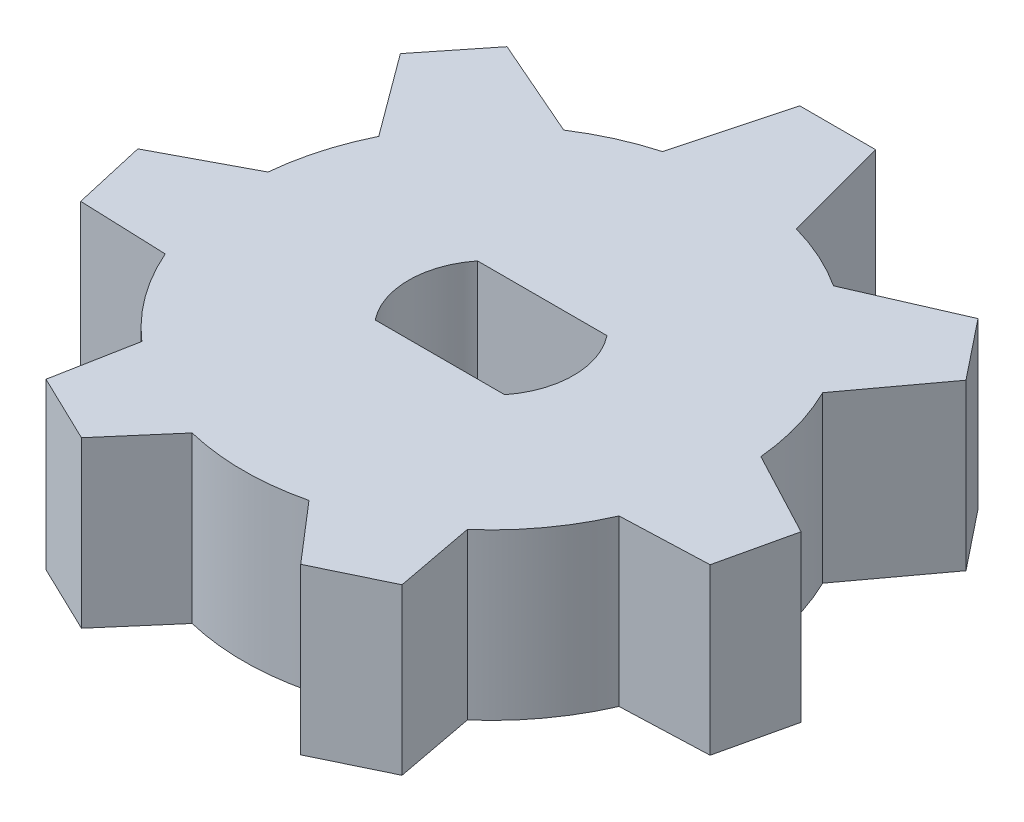
ISO-10303-21;
HEADER;
FILE_DESCRIPTION(('STEP AP214'),'2;1');
FILE_NAME('part.step','',(''),(''),'','','');
FILE_SCHEMA(('AUTOMOTIVE_DESIGN { 1 0 10303 214 1 1 1 1 }'));
ENDSEC;
DATA;
#1=APPLICATION_CONTEXT('core data for automotive mechanical design processes');
#2=APPLICATION_PROTOCOL_DEFINITION('international standard','automotive_design',2000,#1);
#3=PRODUCT_CONTEXT('',#1,'mechanical');
#4=PRODUCT('Part','Part','',(#3));
#5=PRODUCT_RELATED_PRODUCT_CATEGORY('part','',(#4));
#6=PRODUCT_DEFINITION_FORMATION('','',#4);
#7=PRODUCT_DEFINITION_CONTEXT('part definition',#1,'design');
#8=PRODUCT_DEFINITION('design','',#6,#7);
#9=PRODUCT_DEFINITION_SHAPE('','',#8);
#10=(LENGTH_UNIT() NAMED_UNIT(*) SI_UNIT(.MILLI.,.METRE.));
#11=(NAMED_UNIT(*) PLANE_ANGLE_UNIT() SI_UNIT($,.RADIAN.));
#12=(NAMED_UNIT(*) SI_UNIT($,.STERADIAN.) SOLID_ANGLE_UNIT());
#13=UNCERTAINTY_MEASURE_WITH_UNIT(LENGTH_MEASURE(1.E-05),#10,'distance_accuracy_value','');
#14=(GEOMETRIC_REPRESENTATION_CONTEXT(3) GLOBAL_UNCERTAINTY_ASSIGNED_CONTEXT((#13)) GLOBAL_UNIT_ASSIGNED_CONTEXT((#10,
#11,#12)) REPRESENTATION_CONTEXT('',''));
#15=CARTESIAN_POINT('',(0.,0.,0.));
#16=DIRECTION('',(0.,0.,1.));
#17=DIRECTION('',(1.,0.,0.));
#18=AXIS2_PLACEMENT_3D('',#15,#16,#17);
#19=CARTESIAN_POINT('',(0.,5.,0.));
#20=DIRECTION('',(0.,-1.,0.));
#21=DIRECTION('',(0.,0.,-1.));
#22=AXIS2_PLACEMENT_3D('',#19,#20,#21);
#23=CYLINDRICAL_SURFACE('',#22,7.5);
#24=CARTESIAN_POINT('',(0.,5.,0.));
#25=DIRECTION('',(0.,1.,0.));
#26=DIRECTION('',(0.,0.,1.));
#27=AXIS2_PLACEMENT_3D('',#24,#25,#26);
#28=CIRCLE('',#27,7.5);
#29=CARTESIAN_POINT('',(4.087350496693,5.,-6.28836750812033));
#30=VERTEX_POINT('',#29);
#31=CARTESIAN_POINT('',(2.0287675427603,5.,-7.22039488237605));
#32=VERTEX_POINT('',#31);
#33=EDGE_CURVE('E47',#30,#32,#28,.T.);
#34=ORIENTED_EDGE('',*,*,#33,.F.);
#35=DIRECTION('',(0.,-1.,0.));
#36=VECTOR('',#35,1.);
#37=CARTESIAN_POINT('',(4.087350496693,5.,-6.28836750812033));
#38=LINE('',#37,#36);
#39=CARTESIAN_POINT('',(4.087350496693,0.,-6.28836750812033));
#40=VERTEX_POINT('',#39);
#41=EDGE_CURVE('E303',#30,#40,#38,.T.);
#42=ORIENTED_EDGE('',*,*,#41,.T.);
#43=CARTESIAN_POINT('',(0.,0.,0.));
#44=DIRECTION('',(0.,1.,0.));
#45=DIRECTION('',(0.,0.,1.));
#46=AXIS2_PLACEMENT_3D('',#43,#44,#45);
#47=CIRCLE('',#46,7.5);
#48=CARTESIAN_POINT('',(2.0287675427603,0.,-7.22039488237605));
#49=VERTEX_POINT('',#48);
#50=EDGE_CURVE('E455',#40,#49,#47,.T.);
#51=ORIENTED_EDGE('',*,*,#50,.T.);
#52=DIRECTION('',(0.,-1.,0.));
#53=VECTOR('',#52,1.);
#54=CARTESIAN_POINT('',(2.0287675427603,5.,-7.22039488237605));
#55=LINE('',#54,#53);
#56=EDGE_CURVE('E448',#49,#32,#55,.F.);
#57=ORIENTED_EDGE('',*,*,#56,.T.);
#58=EDGE_LOOP('',(#34,#42,#51,#57));
#59=FACE_BOUND('',#58,.T.);
#60=ADVANCED_FACE('F37',(#59),#23,.T.);
#61=CARTESIAN_POINT('',(7.46656111778389,0.,-0.707435562011001));
#62=VERTEX_POINT('',#61);
#63=CARTESIAN_POINT('',(6.72463491176644,0.,-3.32103678140607));
#64=VERTEX_POINT('',#63);
#65=EDGE_CURVE('E461',#62,#64,#47,.T.);
#66=ORIENTED_EDGE('',*,*,#65,.T.);
#67=DIRECTION('',(0.,-1.,0.));
#68=VECTOR('',#67,1.);
#69=CARTESIAN_POINT('',(6.72463491176644,5.,-3.32103678140607));
#70=LINE('',#69,#68);
#71=CARTESIAN_POINT('',(6.72463491176644,5.,-3.32103678140607));
#72=VERTEX_POINT('',#71);
#73=EDGE_CURVE('E298',#64,#72,#70,.F.);
#74=ORIENTED_EDGE('',*,*,#73,.T.);
#75=CARTESIAN_POINT('',(7.46656111778389,5.,-0.707435562011001));
#76=VERTEX_POINT('',#75);
#77=EDGE_CURVE('E468',#76,#72,#28,.T.);
#78=ORIENTED_EDGE('',*,*,#77,.F.);
#79=DIRECTION('',(0.,-1.,0.));
#80=VECTOR('',#79,1.);
#81=CARTESIAN_POINT('',(7.46656111778389,5.,-0.707435562011001));
#82=LINE('',#81,#80);
#83=EDGE_CURVE('E328',#76,#62,#82,.T.);
#84=ORIENTED_EDGE('',*,*,#83,.T.);
#85=EDGE_LOOP('',(#66,#74,#78,#84));
#86=FACE_BOUND('',#85,.T.);
#87=ADVANCED_FACE('F510',(#86),#23,.T.);
#88=CARTESIAN_POINT('',(4.93156874132972,0.,5.65063091606058));
#89=VERTEX_POINT('',#88);
#90=CARTESIAN_POINT('',(6.87466724393987,0.,2.99815781524258));
#91=VERTEX_POINT('',#90);
#92=EDGE_CURVE('E466',#89,#91,#47,.T.);
#93=ORIENTED_EDGE('',*,*,#92,.T.);
#94=DIRECTION('',(0.,-1.,0.));
#95=VECTOR('',#94,1.);
#96=CARTESIAN_POINT('',(6.87466724393987,5.,2.99815781524258));
#97=LINE('',#96,#95);
#98=CARTESIAN_POINT('',(6.87466724393987,5.,2.99815781524258));
#99=VERTEX_POINT('',#98);
#100=EDGE_CURVE('E323',#91,#99,#97,.F.);
#101=ORIENTED_EDGE('',*,*,#100,.T.);
#102=CARTESIAN_POINT('',(4.93156874132972,5.,5.65063091606058));
#103=VERTEX_POINT('',#102);
#104=EDGE_CURVE('E503',#103,#99,#28,.T.);
#105=ORIENTED_EDGE('',*,*,#104,.F.);
#106=DIRECTION('',(0.,-1.,0.));
#107=VECTOR('',#106,1.);
#108=CARTESIAN_POINT('',(4.93156874132972,5.,5.65063091606058));
#109=LINE('',#108,#107);
#110=EDGE_CURVE('E353',#103,#89,#109,.T.);
#111=ORIENTED_EDGE('',*,*,#110,.T.);
#112=EDGE_LOOP('',(#93,#101,#105,#111));
#113=FACE_BOUND('',#112,.T.);
#114=ADVANCED_FACE('F483',(#113),#23,.T.);
#115=CARTESIAN_POINT('',(-1.7706164222413,0.,7.28799818093346));
#116=VERTEX_POINT('',#115);
#117=CARTESIAN_POINT('',(1.77061642224143,0.,7.28799818093343));
#118=VERTEX_POINT('',#117);
#119=EDGE_CURVE('E474',#116,#118,#47,.T.);
#120=ORIENTED_EDGE('',*,*,#119,.T.);
#121=DIRECTION('',(0.,-1.,0.));
#122=VECTOR('',#121,1.);
#123=CARTESIAN_POINT('',(1.77061642224143,5.,7.28799818093343));
#124=LINE('',#123,#122);
#125=CARTESIAN_POINT('',(1.77061642224143,5.,7.28799818093343));
#126=VERTEX_POINT('',#125);
#127=EDGE_CURVE('E348',#118,#126,#124,.F.);
#128=ORIENTED_EDGE('',*,*,#127,.T.);
#129=CARTESIAN_POINT('',(-1.7706164222413,5.,7.28799818093346));
#130=VERTEX_POINT('',#129);
#131=EDGE_CURVE('E505',#130,#126,#28,.T.);
#132=ORIENTED_EDGE('',*,*,#131,.F.);
#133=DIRECTION('',(0.,-1.,0.));
#134=VECTOR('',#133,1.);
#135=CARTESIAN_POINT('',(-1.7706164222413,5.,7.28799818093346));
#136=LINE('',#135,#134);
#137=EDGE_CURVE('E378',#130,#116,#136,.T.);
#138=ORIENTED_EDGE('',*,*,#137,.T.);
#139=EDGE_LOOP('',(#120,#128,#132,#138));
#140=FACE_BOUND('',#139,.T.);
#141=ADVANCED_FACE('F575',(#140),#23,.T.);
#142=CARTESIAN_POINT('',(-6.87466724393982,0.,2.99815781524269));
#143=VERTEX_POINT('',#142);
#144=CARTESIAN_POINT('',(-4.93156874132962,0.,5.65063091606067));
#145=VERTEX_POINT('',#144);
#146=EDGE_CURVE('E470',#143,#145,#47,.T.);
#147=ORIENTED_EDGE('',*,*,#146,.T.);
#148=DIRECTION('',(0.,-1.,0.));
#149=VECTOR('',#148,1.);
#150=CARTESIAN_POINT('',(-4.93156874132962,5.,5.65063091606067));
#151=LINE('',#150,#149);
#152=CARTESIAN_POINT('',(-4.93156874132962,5.,5.65063091606067));
#153=VERTEX_POINT('',#152);
#154=EDGE_CURVE('E373',#145,#153,#151,.F.);
#155=ORIENTED_EDGE('',*,*,#154,.T.);
#156=CARTESIAN_POINT('',(-6.87466724393982,5.,2.99815781524269));
#157=VERTEX_POINT('',#156);
#158=EDGE_CURVE('E507',#157,#153,#28,.T.);
#159=ORIENTED_EDGE('',*,*,#158,.F.);
#160=DIRECTION('',(0.,-1.,0.));
#161=VECTOR('',#160,1.);
#162=CARTESIAN_POINT('',(-6.87466724393982,5.,2.99815781524269));
#163=LINE('',#162,#161);
#164=EDGE_CURVE('E403',#157,#143,#163,.T.);
#165=ORIENTED_EDGE('',*,*,#164,.T.);
#166=EDGE_LOOP('',(#147,#155,#159,#165));
#167=FACE_BOUND('',#166,.T.);
#168=ADVANCED_FACE('F559',(#167),#23,.T.);
#169=CARTESIAN_POINT('',(-6.7246349117665,0.,-3.32103678140595));
#170=VERTEX_POINT('',#169);
#171=CARTESIAN_POINT('',(-7.4665611177839,0.,-0.707435562010873));
#172=VERTEX_POINT('',#171);
#173=EDGE_CURVE('E467',#170,#172,#47,.T.);
#174=ORIENTED_EDGE('',*,*,#173,.T.);
#175=DIRECTION('',(0.,-1.,0.));
#176=VECTOR('',#175,1.);
#177=CARTESIAN_POINT('',(-7.4665611177839,5.,-0.707435562010874));
#178=LINE('',#177,#176);
#179=CARTESIAN_POINT('',(-7.4665611177839,5.,-0.707435562010873));
#180=VERTEX_POINT('',#179);
#181=EDGE_CURVE('E398',#172,#180,#178,.F.);
#182=ORIENTED_EDGE('',*,*,#181,.T.);
#183=CARTESIAN_POINT('',(-6.7246349117665,5.,-3.32103678140595));
#184=VERTEX_POINT('',#183);
#185=EDGE_CURVE('E46',#184,#180,#28,.T.);
#186=ORIENTED_EDGE('',*,*,#185,.F.);
#187=DIRECTION('',(0.,-1.,0.));
#188=VECTOR('',#187,1.);
#189=CARTESIAN_POINT('',(-6.7246349117665,5.,-3.32103678140595));
#190=LINE('',#189,#188);
#191=EDGE_CURVE('E428',#184,#170,#190,.T.);
#192=ORIENTED_EDGE('',*,*,#191,.T.);
#193=EDGE_LOOP('',(#174,#182,#186,#192));
#194=FACE_BOUND('',#193,.T.);
#195=ADVANCED_FACE('F554',(#194),#23,.T.);
#196=CARTESIAN_POINT('',(-2.02876754276033,0.,-7.22039488237605));
#197=VERTEX_POINT('',#196);
#198=CARTESIAN_POINT('',(-4.08735049669311,0.,-6.28836750812026));
#199=VERTEX_POINT('',#198);
#200=EDGE_CURVE('E41',#197,#199,#47,.T.);
#201=ORIENTED_EDGE('',*,*,#200,.T.);
#202=DIRECTION('',(0.,-1.,0.));
#203=VECTOR('',#202,1.);
#204=CARTESIAN_POINT('',(-4.08735049669311,5.,-6.28836750812026));
#205=LINE('',#204,#203);
#206=CARTESIAN_POINT('',(-4.08735049669311,5.,-6.28836750812026));
#207=VERTEX_POINT('',#206);
#208=EDGE_CURVE('E423',#199,#207,#205,.F.);
#209=ORIENTED_EDGE('',*,*,#208,.T.);
#210=CARTESIAN_POINT('',(-2.02876754276033,5.,-7.22039488237605));
#211=VERTEX_POINT('',#210);
#212=EDGE_CURVE('E11',#211,#207,#28,.T.);
#213=ORIENTED_EDGE('',*,*,#212,.F.);
#214=DIRECTION('',(0.,-1.,0.));
#215=VECTOR('',#214,1.);
#216=CARTESIAN_POINT('',(-2.02876754276033,5.,-7.22039488237605));
#217=LINE('',#216,#215);
#218=EDGE_CURVE('E453',#211,#197,#217,.T.);
#219=ORIENTED_EDGE('',*,*,#218,.T.);
#220=EDGE_LOOP('',(#201,#209,#213,#219));
#221=FACE_BOUND('',#220,.T.);
#222=ADVANCED_FACE('F39',(#221),#23,.T.);
#223=CARTESIAN_POINT('',(0.,5.,0.));
#224=DIRECTION('',(0.,1.,0.));
#225=DIRECTION('',(0.,0.,1.));
#226=AXIS2_PLACEMENT_3D('',#223,#224,#225);
#227=PLANE('',#226);
#228=DIRECTION('',(1.,0.,0.));
#229=VECTOR('',#228,1.);
#230=CARTESIAN_POINT('',(0.,5.,1.55));
#231=LINE('',#230,#229);
#232=CARTESIAN_POINT('',(-1.9615045245933,5.,1.55));
#233=VERTEX_POINT('',#232);
#234=CARTESIAN_POINT('',(1.9615045245933,5.,1.55));
#235=VERTEX_POINT('',#234);
#236=EDGE_CURVE('E54',#233,#235,#231,.T.);
#237=ORIENTED_EDGE('',*,*,#236,.F.);
#238=CARTESIAN_POINT('',(0.,5.,0.));
#239=DIRECTION('',(0.,1.,0.));
#240=DIRECTION('',(0.,0.,1.));
#241=AXIS2_PLACEMENT_3D('',#238,#239,#240);
#242=CIRCLE('',#241,2.5);
#243=CARTESIAN_POINT('',(-1.9615045245933,5.,-1.55));
#244=VERTEX_POINT('',#243);
#245=EDGE_CURVE('E265',#244,#233,#242,.T.);
#246=ORIENTED_EDGE('',*,*,#245,.F.);
#247=DIRECTION('',(1.,0.,0.));
#248=VECTOR('',#247,1.);
#249=CARTESIAN_POINT('',(0.,5.,-1.55));
#250=LINE('',#249,#248);
#251=CARTESIAN_POINT('',(1.9615045245933,5.,-1.55));
#252=VERTEX_POINT('',#251);
#253=EDGE_CURVE('E268',#244,#252,#250,.T.);
#254=ORIENTED_EDGE('',*,*,#253,.T.);
#255=EDGE_CURVE('E270',#235,#252,#242,.T.);
#256=ORIENTED_EDGE('',*,*,#255,.F.);
#257=EDGE_LOOP('',(#237,#246,#254,#256));
#258=FACE_BOUND('',#257,.T.);
#259=ORIENTED_EDGE('',*,*,#77,.T.);
#260=DIRECTION('',(0.593820185573494,0.,-0.804597779766674));
#261=VECTOR('',#260,1.);
#262=CARTESIAN_POINT('',(8.56873512255816,5.,-5.81970383806279));
#263=LINE('',#262,#261);
#264=CARTESIAN_POINT('',(8.56873512255816,5.,-5.81970383806279));
#265=VERTEX_POINT('',#264);
#266=EDGE_CURVE('E292',#72,#265,#263,.T.);
#267=ORIENTED_EDGE('',*,*,#266,.T.);
#268=DIRECTION('',(-0.623489801858743,0.,-0.781831482468022));
#269=VECTOR('',#268,1.);
#270=CARTESIAN_POINT('',(7.13470857828305,5.,-7.61791624773924));
#271=LINE('',#270,#269);
#272=CARTESIAN_POINT('',(7.13470857828305,5.,-7.61791624773924));
#273=VERTEX_POINT('',#272);
#274=EDGE_CURVE('E285',#265,#273,#271,.T.);
#275=ORIENTED_EDGE('',*,*,#274,.T.);
#276=DIRECTION('',(-0.916562255869973,0.,0.399892024319748));
#277=VECTOR('',#276,1.);
#278=CARTESIAN_POINT('',(3.81357582850514,5.,-6.16892084143952));
#279=LINE('',#278,#277);
#280=EDGE_CURVE('E278',#273,#30,#279,.T.);
#281=ORIENTED_EDGE('',*,*,#280,.T.);
#282=ORIENTED_EDGE('',*,*,#33,.T.);
#283=DIRECTION('',(-0.258819045102518,0.,-0.965925826289069));
#284=VECTOR('',#283,1.);
#285=CARTESIAN_POINT('',(1.15,5.,-10.5));
#286=LINE('',#285,#284);
#287=CARTESIAN_POINT('',(1.15,5.,-10.5));
#288=VERTEX_POINT('',#287);
#289=EDGE_CURVE('E442',#32,#288,#286,.T.);
#290=ORIENTED_EDGE('',*,*,#289,.T.);
#291=DIRECTION('',(-1.,0.,0.));
#292=VECTOR('',#291,1.);
#293=CARTESIAN_POINT('',(-1.15,5.,-10.5));
#294=LINE('',#293,#292);
#295=CARTESIAN_POINT('',(-1.15,5.,-10.5));
#296=VERTEX_POINT('',#295);
#297=EDGE_CURVE('E435',#288,#296,#294,.T.);
#298=ORIENTED_EDGE('',*,*,#297,.T.);
#299=DIRECTION('',(-0.258819045102525,0.,0.965925826289067));
#300=VECTOR('',#299,1.);
#301=CARTESIAN_POINT('',(-2.08782217350895,5.,-7.));
#302=LINE('',#301,#300);
#303=EDGE_CURVE('E431',#296,#211,#302,.T.);
#304=ORIENTED_EDGE('',*,*,#303,.T.);
#305=ORIENTED_EDGE('',*,*,#212,.T.);
#306=DIRECTION('',(-0.916562255869976,0.,-0.399892024319742));
#307=VECTOR('',#306,1.);
#308=CARTESIAN_POINT('',(-7.13470857828315,5.,-7.61791624773914));
#309=LINE('',#308,#307);
#310=CARTESIAN_POINT('',(-7.13470857828315,5.,-7.61791624773914));
#311=VERTEX_POINT('',#310);
#312=EDGE_CURVE('E417',#207,#311,#309,.T.);
#313=ORIENTED_EDGE('',*,*,#312,.T.);
#314=DIRECTION('',(-0.623489801858732,0.,0.781831482468031));
#315=VECTOR('',#314,1.);
#316=CARTESIAN_POINT('',(-8.56873512255824,5.,-5.81970383806267));
#317=LINE('',#316,#315);
#318=CARTESIAN_POINT('',(-8.56873512255824,5.,-5.81970383806267));
#319=VERTEX_POINT('',#318);
#320=EDGE_CURVE('E410',#311,#319,#317,.T.);
#321=ORIENTED_EDGE('',*,*,#320,.T.);
#322=DIRECTION('',(0.5938201855735,0.,0.80459777976667));
#323=VECTOR('',#322,1.);
#324=CARTESIAN_POINT('',(-6.41704749505995,5.,-2.90427063135121));
#325=LINE('',#324,#323);
#326=EDGE_CURVE('E406',#319,#184,#325,.T.);
#327=ORIENTED_EDGE('',*,*,#326,.T.);
#328=ORIENTED_EDGE('',*,*,#185,.T.);
#329=DIRECTION('',(-0.884115393504609,0.,0.467268628273063));
#330=VECTOR('',#329,1.);
#331=CARTESIAN_POINT('',(-10.0468360755871,5.,0.656279569472988));
#332=LINE('',#331,#330);
#333=CARTESIAN_POINT('',(-10.0468360755871,5.,0.656279569472988));
#334=VERTEX_POINT('',#333);
#335=EDGE_CURVE('E392',#180,#334,#332,.T.);
#336=ORIENTED_EDGE('',*,*,#335,.T.);
#337=DIRECTION('',(0.222520933956318,0.,0.974927912181823));
#338=VECTOR('',#337,1.);
#339=CARTESIAN_POINT('',(-9.53503792748758,5.,2.89861376749118));
#340=LINE('',#339,#338);
#341=CARTESIAN_POINT('',(-9.53503792748758,5.,2.89861376749118));
#342=VERTEX_POINT('',#341);
#343=EDGE_CURVE('E385',#334,#342,#340,.T.);
#344=ORIENTED_EDGE('',*,*,#343,.T.);
#345=DIRECTION('',(0.999300704788399,0.,0.0373911942763261));
#346=VECTOR('',#345,1.);
#347=CARTESIAN_POINT('',(-5.91410516891705,5.,3.03409951226096));
#348=LINE('',#347,#346);
#349=EDGE_CURVE('E381',#342,#157,#348,.T.);
#350=ORIENTED_EDGE('',*,*,#349,.T.);
#351=ORIENTED_EDGE('',*,*,#158,.T.);
#352=DIRECTION('',(-0.185911607162911,0.,0.982566473233289));
#353=VECTOR('',#352,1.);
#354=CARTESIAN_POINT('',(-5.39349108986679,5.,8.09194923844));
#355=LINE('',#354,#353);
#356=CARTESIAN_POINT('',(-5.39349108986679,5.,8.09194923844));
#357=VERTEX_POINT('',#356);
#358=EDGE_CURVE('E367',#153,#357,#355,.T.);
#359=ORIENTED_EDGE('',*,*,#358,.T.);
#360=DIRECTION('',(0.900968867902422,0.,0.433883739117553));
#361=VECTOR('',#360,1.);
#362=CARTESIAN_POINT('',(-3.32126269369122,5.,9.08988183841038));
#363=LINE('',#362,#361);
#364=CARTESIAN_POINT('',(-3.32126269369122,5.,9.08988183841038));
#365=VERTEX_POINT('',#364);
#366=EDGE_CURVE('E360',#357,#365,#363,.T.);
#367=ORIENTED_EDGE('',*,*,#366,.T.);
#368=DIRECTION('',(0.65228741127812,0.,-0.757971723145454));
#369=VECTOR('',#368,1.);
#370=CARTESIAN_POINT('',(-0.957721024819641,5.,6.34339659202131));
#371=LINE('',#370,#369);
#372=EDGE_CURVE('E356',#365,#130,#371,.T.);
#373=ORIENTED_EDGE('',*,*,#372,.T.);
#374=ORIENTED_EDGE('',*,*,#131,.T.);
#375=DIRECTION('',(0.652287411278125,0.,0.75797172314545));
#376=VECTOR('',#375,1.);
#377=CARTESIAN_POINT('',(3.32126269369135,5.,9.08988183841033));
#378=LINE('',#377,#376);
#379=CARTESIAN_POINT('',(3.32126269369135,5.,9.08988183841033));
#380=VERTEX_POINT('',#379);
#381=EDGE_CURVE('E342',#126,#380,#378,.T.);
#382=ORIENTED_EDGE('',*,*,#381,.T.);
#383=DIRECTION('',(0.900968867902416,0.,-0.433883739117565));
#384=VECTOR('',#383,1.);
#385=CARTESIAN_POINT('',(5.39349108986691,5.,8.09194923843993));
#386=LINE('',#385,#384);
#387=CARTESIAN_POINT('',(5.39349108986691,5.,8.09194923843993));
#388=VERTEX_POINT('',#387);
#389=EDGE_CURVE('E335',#380,#388,#386,.T.);
#390=ORIENTED_EDGE('',*,*,#389,.T.);
#391=DIRECTION('',(-0.185911607162918,0.,-0.982566473233288));
#392=VECTOR('',#391,1.);
#393=CARTESIAN_POINT('',(4.71984658491557,5.,4.53165240951205));
#394=LINE('',#393,#392);
#395=EDGE_CURVE('E331',#388,#103,#394,.T.);
#396=ORIENTED_EDGE('',*,*,#395,.T.);
#397=ORIENTED_EDGE('',*,*,#104,.T.);
#398=DIRECTION('',(0.999300704788398,0.,-0.0373911942763323));
#399=VECTOR('',#398,1.);
#400=CARTESIAN_POINT('',(9.53503792748763,5.,2.89861376749105));
#401=LINE('',#400,#399);
#402=CARTESIAN_POINT('',(9.53503792748763,5.,2.89861376749105));
#403=VERTEX_POINT('',#402);
#404=EDGE_CURVE('E317',#99,#403,#401,.T.);
#405=ORIENTED_EDGE('',*,*,#404,.T.);
#406=DIRECTION('',(0.222520933956305,0.,-0.974927912181826));
#407=VECTOR('',#406,1.);
#408=CARTESIAN_POINT('',(10.0468360755871,5.,0.656279569472853));
#409=LINE('',#408,#407);
#410=CARTESIAN_POINT('',(10.0468360755871,5.,0.656279569472853));
#411=VERTEX_POINT('',#410);
#412=EDGE_CURVE('E310',#403,#411,#409,.T.);
#413=ORIENTED_EDGE('',*,*,#412,.T.);
#414=DIRECTION('',(-0.884115393504612,0.,-0.467268628273057));
#415=VECTOR('',#414,1.);
#416=CARTESIAN_POINT('',(6.84327344888488,5.,-1.03685271299111));
#417=LINE('',#416,#415);
#418=EDGE_CURVE('E306',#411,#76,#417,.T.);
#419=ORIENTED_EDGE('',*,*,#418,.T.);
#420=EDGE_LOOP('',(#259,#267,#275,#281,#282,#290,#298,#304,#305,#313,#321,#327,#328,#336,#344,
#350,#351,#359,#367,#373,#374,#382,#390,#396,#397,#405,#413,#419));
#421=FACE_BOUND('',#420,.T.);
#422=ADVANCED_FACE('F501',(#258,#421),#227,.T.);
#423=CARTESIAN_POINT('',(0.,0.,0.));
#424=DIRECTION('',(0.,1.,0.));
#425=DIRECTION('',(0.,0.,1.));
#426=AXIS2_PLACEMENT_3D('',#423,#424,#425);
#427=PLANE('',#426);
#428=CARTESIAN_POINT('',(0.,0.,0.));
#429=DIRECTION('',(0.,1.,0.));
#430=DIRECTION('',(0.,0.,1.));
#431=AXIS2_PLACEMENT_3D('',#428,#429,#430);
#432=CIRCLE('',#431,2.5);
#433=CARTESIAN_POINT('',(-1.9615045245933,0.,-1.55));
#434=VERTEX_POINT('',#433);
#435=CARTESIAN_POINT('',(-1.9615045245933,0.,1.55));
#436=VERTEX_POINT('',#435);
#437=EDGE_CURVE('E253',#434,#436,#432,.T.);
#438=ORIENTED_EDGE('',*,*,#437,.T.);
#439=DIRECTION('',(1.,0.,0.));
#440=VECTOR('',#439,1.);
#441=CARTESIAN_POINT('',(0.,0.,1.55));
#442=LINE('',#441,#440);
#443=CARTESIAN_POINT('',(1.9615045245933,0.,1.55));
#444=VERTEX_POINT('',#443);
#445=EDGE_CURVE('E250',#436,#444,#442,.T.);
#446=ORIENTED_EDGE('',*,*,#445,.T.);
#447=CARTESIAN_POINT('',(1.9615045245933,0.,-1.55));
#448=VERTEX_POINT('',#447);
#449=EDGE_CURVE('E256',#444,#448,#432,.T.);
#450=ORIENTED_EDGE('',*,*,#449,.T.);
#451=DIRECTION('',(1.,0.,0.));
#452=VECTOR('',#451,1.);
#453=CARTESIAN_POINT('',(0.,0.,-1.55));
#454=LINE('',#453,#452);
#455=EDGE_CURVE('E260',#434,#448,#454,.T.);
#456=ORIENTED_EDGE('',*,*,#455,.F.);
#457=EDGE_LOOP('',(#438,#446,#450,#456));
#458=FACE_BOUND('',#457,.T.);
#459=ORIENTED_EDGE('',*,*,#50,.F.);
#460=DIRECTION('',(-0.916562255869973,0.,0.399892024319748));
#461=VECTOR('',#460,1.);
#462=CARTESIAN_POINT('',(3.81357582850514,0.,-6.16892084143952));
#463=LINE('',#462,#461);
#464=CARTESIAN_POINT('',(7.13470857828305,0.,-7.61791624773924));
#465=VERTEX_POINT('',#464);
#466=EDGE_CURVE('E282',#465,#40,#463,.T.);
#467=ORIENTED_EDGE('',*,*,#466,.F.);
#468=DIRECTION('',(-0.623489801858743,0.,-0.781831482468022));
#469=VECTOR('',#468,1.);
#470=CARTESIAN_POINT('',(7.13470857828305,0.,-7.61791624773924));
#471=LINE('',#470,#469);
#472=CARTESIAN_POINT('',(8.56873512255816,0.,-5.81970383806279));
#473=VERTEX_POINT('',#472);
#474=EDGE_CURVE('E287',#473,#465,#471,.T.);
#475=ORIENTED_EDGE('',*,*,#474,.F.);
#476=DIRECTION('',(0.593820185573494,0.,-0.804597779766674));
#477=VECTOR('',#476,1.);
#478=CARTESIAN_POINT('',(8.56873512255816,0.,-5.81970383806279));
#479=LINE('',#478,#477);
#480=EDGE_CURVE('E284',#64,#473,#479,.T.);
#481=ORIENTED_EDGE('',*,*,#480,.F.);
#482=ORIENTED_EDGE('',*,*,#65,.F.);
#483=DIRECTION('',(-0.884115393504612,0.,-0.467268628273057));
#484=VECTOR('',#483,1.);
#485=CARTESIAN_POINT('',(6.84327344888488,0.,-1.03685271299111));
#486=LINE('',#485,#484);
#487=CARTESIAN_POINT('',(10.0468360755871,0.,0.656279569472853));
#488=VERTEX_POINT('',#487);
#489=EDGE_CURVE('E307',#488,#62,#486,.T.);
#490=ORIENTED_EDGE('',*,*,#489,.F.);
#491=DIRECTION('',(0.222520933956305,0.,-0.974927912181826));
#492=VECTOR('',#491,1.);
#493=CARTESIAN_POINT('',(10.0468360755871,0.,0.656279569472853));
#494=LINE('',#493,#492);
#495=CARTESIAN_POINT('',(9.53503792748763,0.,2.89861376749105));
#496=VERTEX_POINT('',#495);
#497=EDGE_CURVE('E312',#496,#488,#494,.T.);
#498=ORIENTED_EDGE('',*,*,#497,.F.);
#499=DIRECTION('',(0.999300704788398,0.,-0.0373911942763323));
#500=VECTOR('',#499,1.);
#501=CARTESIAN_POINT('',(9.53503792748763,0.,2.89861376749105));
#502=LINE('',#501,#500);
#503=EDGE_CURVE('E309',#91,#496,#502,.T.);
#504=ORIENTED_EDGE('',*,*,#503,.F.);
#505=ORIENTED_EDGE('',*,*,#92,.F.);
#506=DIRECTION('',(-0.185911607162918,0.,-0.982566473233288));
#507=VECTOR('',#506,1.);
#508=CARTESIAN_POINT('',(4.71984658491557,0.,4.53165240951205));
#509=LINE('',#508,#507);
#510=CARTESIAN_POINT('',(5.39349108986691,0.,8.09194923843993));
#511=VERTEX_POINT('',#510);
#512=EDGE_CURVE('E332',#511,#89,#509,.T.);
#513=ORIENTED_EDGE('',*,*,#512,.F.);
#514=DIRECTION('',(0.900968867902416,0.,-0.433883739117565));
#515=VECTOR('',#514,1.);
#516=CARTESIAN_POINT('',(5.39349108986691,0.,8.09194923843993));
#517=LINE('',#516,#515);
#518=CARTESIAN_POINT('',(3.32126269369135,0.,9.08988183841033));
#519=VERTEX_POINT('',#518);
#520=EDGE_CURVE('E337',#519,#511,#517,.T.);
#521=ORIENTED_EDGE('',*,*,#520,.F.);
#522=DIRECTION('',(0.652287411278125,0.,0.75797172314545));
#523=VECTOR('',#522,1.);
#524=CARTESIAN_POINT('',(3.32126269369135,0.,9.08988183841033));
#525=LINE('',#524,#523);
#526=EDGE_CURVE('E334',#118,#519,#525,.T.);
#527=ORIENTED_EDGE('',*,*,#526,.F.);
#528=ORIENTED_EDGE('',*,*,#119,.F.);
#529=DIRECTION('',(0.65228741127812,0.,-0.757971723145454));
#530=VECTOR('',#529,1.);
#531=CARTESIAN_POINT('',(-0.957721024819641,0.,6.34339659202131));
#532=LINE('',#531,#530);
#533=CARTESIAN_POINT('',(-3.32126269369122,0.,9.08988183841038));
#534=VERTEX_POINT('',#533);
#535=EDGE_CURVE('E357',#534,#116,#532,.T.);
#536=ORIENTED_EDGE('',*,*,#535,.F.);
#537=DIRECTION('',(0.900968867902422,0.,0.433883739117553));
#538=VECTOR('',#537,1.);
#539=CARTESIAN_POINT('',(-3.32126269369122,0.,9.08988183841038));
#540=LINE('',#539,#538);
#541=CARTESIAN_POINT('',(-5.39349108986679,0.,8.09194923844));
#542=VERTEX_POINT('',#541);
#543=EDGE_CURVE('E362',#542,#534,#540,.T.);
#544=ORIENTED_EDGE('',*,*,#543,.F.);
#545=DIRECTION('',(-0.185911607162911,0.,0.982566473233289));
#546=VECTOR('',#545,1.);
#547=CARTESIAN_POINT('',(-5.39349108986679,0.,8.09194923844));
#548=LINE('',#547,#546);
#549=EDGE_CURVE('E359',#145,#542,#548,.T.);
#550=ORIENTED_EDGE('',*,*,#549,.F.);
#551=ORIENTED_EDGE('',*,*,#146,.F.);
#552=DIRECTION('',(0.999300704788399,0.,0.0373911942763261));
#553=VECTOR('',#552,1.);
#554=CARTESIAN_POINT('',(-5.91410516891705,0.,3.03409951226096));
#555=LINE('',#554,#553);
#556=CARTESIAN_POINT('',(-9.53503792748758,0.,2.89861376749118));
#557=VERTEX_POINT('',#556);
#558=EDGE_CURVE('E382',#557,#143,#555,.T.);
#559=ORIENTED_EDGE('',*,*,#558,.F.);
#560=DIRECTION('',(0.222520933956318,0.,0.974927912181823));
#561=VECTOR('',#560,1.);
#562=CARTESIAN_POINT('',(-9.53503792748758,0.,2.89861376749118));
#563=LINE('',#562,#561);
#564=CARTESIAN_POINT('',(-10.0468360755871,0.,0.656279569472988));
#565=VERTEX_POINT('',#564);
#566=EDGE_CURVE('E387',#565,#557,#563,.T.);
#567=ORIENTED_EDGE('',*,*,#566,.F.);
#568=DIRECTION('',(-0.884115393504609,0.,0.467268628273063));
#569=VECTOR('',#568,1.);
#570=CARTESIAN_POINT('',(-10.0468360755871,0.,0.656279569472988));
#571=LINE('',#570,#569);
#572=EDGE_CURVE('E384',#172,#565,#571,.T.);
#573=ORIENTED_EDGE('',*,*,#572,.F.);
#574=ORIENTED_EDGE('',*,*,#173,.F.);
#575=DIRECTION('',(0.5938201855735,0.,0.80459777976667));
#576=VECTOR('',#575,1.);
#577=CARTESIAN_POINT('',(-6.41704749505995,0.,-2.90427063135121));
#578=LINE('',#577,#576);
#579=CARTESIAN_POINT('',(-8.56873512255824,0.,-5.81970383806267));
#580=VERTEX_POINT('',#579);
#581=EDGE_CURVE('E407',#580,#170,#578,.T.);
#582=ORIENTED_EDGE('',*,*,#581,.F.);
#583=DIRECTION('',(-0.623489801858732,0.,0.781831482468031));
#584=VECTOR('',#583,1.);
#585=CARTESIAN_POINT('',(-8.56873512255824,0.,-5.81970383806267));
#586=LINE('',#585,#584);
#587=CARTESIAN_POINT('',(-7.13470857828315,0.,-7.61791624773914));
#588=VERTEX_POINT('',#587);
#589=EDGE_CURVE('E412',#588,#580,#586,.T.);
#590=ORIENTED_EDGE('',*,*,#589,.F.);
#591=DIRECTION('',(-0.916562255869976,0.,-0.399892024319742));
#592=VECTOR('',#591,1.);
#593=CARTESIAN_POINT('',(-7.13470857828315,0.,-7.61791624773914));
#594=LINE('',#593,#592);
#595=EDGE_CURVE('E409',#199,#588,#594,.T.);
#596=ORIENTED_EDGE('',*,*,#595,.F.);
#597=ORIENTED_EDGE('',*,*,#200,.F.);
#598=DIRECTION('',(-0.258819045102525,0.,0.965925826289067));
#599=VECTOR('',#598,1.);
#600=CARTESIAN_POINT('',(-2.08782217350895,0.,-7.));
#601=LINE('',#600,#599);
#602=CARTESIAN_POINT('',(-1.15,0.,-10.5));
#603=VERTEX_POINT('',#602);
#604=EDGE_CURVE('E432',#603,#197,#601,.T.);
#605=ORIENTED_EDGE('',*,*,#604,.F.);
#606=DIRECTION('',(-1.,0.,0.));
#607=VECTOR('',#606,1.);
#608=CARTESIAN_POINT('',(-1.15,0.,-10.5));
#609=LINE('',#608,#607);
#610=CARTESIAN_POINT('',(1.15,0.,-10.5));
#611=VERTEX_POINT('',#610);
#612=EDGE_CURVE('E437',#611,#603,#609,.T.);
#613=ORIENTED_EDGE('',*,*,#612,.F.);
#614=DIRECTION('',(-0.258819045102518,0.,-0.965925826289069));
#615=VECTOR('',#614,1.);
#616=CARTESIAN_POINT('',(1.15,0.,-10.5));
#617=LINE('',#616,#615);
#618=EDGE_CURVE('E434',#49,#611,#617,.T.);
#619=ORIENTED_EDGE('',*,*,#618,.F.);
#620=EDGE_LOOP('',(#459,#467,#475,#481,#482,#490,#498,#504,#505,#513,#521,#527,#528,#536,#544,
#550,#551,#559,#567,#573,#574,#582,#590,#596,#597,#605,#613,#619));
#621=FACE_BOUND('',#620,.T.);
#622=ADVANCED_FACE('F262',(#458,#621),#427,.F.);
#623=CARTESIAN_POINT('',(-2.08782217350895,0.,-7.));
#624=DIRECTION('',(-0.965925826289067,0.,-0.258819045102525));
#625=DIRECTION('',(-0.258819045102525,0.,0.965925826289067));
#626=AXIS2_PLACEMENT_3D('',#623,#624,#625);
#627=PLANE('',#626);
#628=ORIENTED_EDGE('',*,*,#218,.F.);
#629=ORIENTED_EDGE('',*,*,#303,.F.);
#630=DIRECTION('',(0.,1.,0.));
#631=VECTOR('',#630,1.);
#632=CARTESIAN_POINT('',(-1.15,0.,-10.5));
#633=LINE('',#632,#631);
#634=EDGE_CURVE('E446',#603,#296,#633,.T.);
#635=ORIENTED_EDGE('',*,*,#634,.F.);
#636=ORIENTED_EDGE('',*,*,#604,.T.);
#637=EDGE_LOOP('',(#628,#629,#635,#636));
#638=FACE_BOUND('',#637,.T.);
#639=ADVANCED_FACE('F538',(#638),#627,.T.);
#640=CARTESIAN_POINT('',(1.15,0.,-10.5));
#641=DIRECTION('',(0.965925826289069,0.,-0.258819045102518));
#642=DIRECTION('',(-0.258819045102518,0.,-0.965925826289069));
#643=AXIS2_PLACEMENT_3D('',#640,#641,#642);
#644=PLANE('',#643);
#645=ORIENTED_EDGE('',*,*,#56,.F.);
#646=ORIENTED_EDGE('',*,*,#618,.T.);
#647=DIRECTION('',(0.,1.,0.));
#648=VECTOR('',#647,1.);
#649=CARTESIAN_POINT('',(1.15,0.,-10.5));
#650=LINE('',#649,#648);
#651=EDGE_CURVE('E440',#611,#288,#650,.T.);
#652=ORIENTED_EDGE('',*,*,#651,.T.);
#653=ORIENTED_EDGE('',*,*,#289,.F.);
#654=EDGE_LOOP('',(#645,#646,#652,#653));
#655=FACE_BOUND('',#654,.T.);
#656=ADVANCED_FACE('F529',(#655),#644,.T.);
#657=CARTESIAN_POINT('',(-1.15,0.,-10.5));
#658=DIRECTION('',(0.,0.,-1.));
#659=DIRECTION('',(-1.,0.,0.));
#660=AXIS2_PLACEMENT_3D('',#657,#658,#659);
#661=PLANE('',#660);
#662=ORIENTED_EDGE('',*,*,#297,.F.);
#663=ORIENTED_EDGE('',*,*,#651,.F.);
#664=ORIENTED_EDGE('',*,*,#612,.T.);
#665=ORIENTED_EDGE('',*,*,#634,.T.);
#666=EDGE_LOOP('',(#662,#663,#664,#665));
#667=FACE_BOUND('',#666,.T.);
#668=ADVANCED_FACE('F535',(#667),#661,.T.);
#669=CARTESIAN_POINT('',(-6.41704749505995,0.,-2.90427063135121));
#670=DIRECTION('',(-0.80459777976667,0.,0.5938201855735));
#671=DIRECTION('',(0.5938201855735,0.,0.80459777976667));
#672=AXIS2_PLACEMENT_3D('',#669,#670,#671);
#673=PLANE('',#672);
#674=ORIENTED_EDGE('',*,*,#191,.F.);
#675=ORIENTED_EDGE('',*,*,#326,.F.);
#676=DIRECTION('',(0.,1.,0.));
#677=VECTOR('',#676,1.);
#678=CARTESIAN_POINT('',(-8.56873512255824,0.,-5.81970383806267));
#679=LINE('',#678,#677);
#680=EDGE_CURVE('E421',#580,#319,#679,.T.);
#681=ORIENTED_EDGE('',*,*,#680,.F.);
#682=ORIENTED_EDGE('',*,*,#581,.T.);
#683=EDGE_LOOP('',(#674,#675,#681,#682));
#684=FACE_BOUND('',#683,.T.);
#685=ADVANCED_FACE('F553',(#684),#673,.T.);
#686=CARTESIAN_POINT('',(-7.13470857828315,0.,-7.61791624773914));
#687=DIRECTION('',(0.399892024319742,0.,-0.916562255869976));
#688=DIRECTION('',(-0.916562255869976,0.,-0.399892024319742));
#689=AXIS2_PLACEMENT_3D('',#686,#687,#688);
#690=PLANE('',#689);
#691=ORIENTED_EDGE('',*,*,#208,.F.);
#692=ORIENTED_EDGE('',*,*,#595,.T.);
#693=DIRECTION('',(0.,1.,0.));
#694=VECTOR('',#693,1.);
#695=CARTESIAN_POINT('',(-7.13470857828315,0.,-7.61791624773914));
#696=LINE('',#695,#694);
#697=EDGE_CURVE('E415',#588,#311,#696,.T.);
#698=ORIENTED_EDGE('',*,*,#697,.T.);
#699=ORIENTED_EDGE('',*,*,#312,.F.);
#700=EDGE_LOOP('',(#691,#692,#698,#699));
#701=FACE_BOUND('',#700,.T.);
#702=ADVANCED_FACE('F541',(#701),#690,.T.);
#703=CARTESIAN_POINT('',(-8.56873512255824,0.,-5.81970383806267));
#704=DIRECTION('',(-0.781831482468031,0.,-0.623489801858732));
#705=DIRECTION('',(-0.623489801858732,0.,0.781831482468031));
#706=AXIS2_PLACEMENT_3D('',#703,#704,#705);
#707=PLANE('',#706);
#708=ORIENTED_EDGE('',*,*,#320,.F.);
#709=ORIENTED_EDGE('',*,*,#697,.F.);
#710=ORIENTED_EDGE('',*,*,#589,.T.);
#711=ORIENTED_EDGE('',*,*,#680,.T.);
#712=EDGE_LOOP('',(#708,#709,#710,#711));
#713=FACE_BOUND('',#712,.T.);
#714=ADVANCED_FACE('F547',(#713),#707,.T.);
#715=CARTESIAN_POINT('',(-5.91410516891705,0.,3.03409951226096));
#716=DIRECTION('',(-0.0373911942763261,0.,0.999300704788399));
#717=DIRECTION('',(0.999300704788399,0.,0.0373911942763261));
#718=AXIS2_PLACEMENT_3D('',#715,#716,#717);
#719=PLANE('',#718);
#720=ORIENTED_EDGE('',*,*,#164,.F.);
#721=ORIENTED_EDGE('',*,*,#349,.F.);
#722=DIRECTION('',(0.,1.,0.));
#723=VECTOR('',#722,1.);
#724=CARTESIAN_POINT('',(-9.53503792748758,0.,2.89861376749118));
#725=LINE('',#724,#723);
#726=EDGE_CURVE('E396',#557,#342,#725,.T.);
#727=ORIENTED_EDGE('',*,*,#726,.F.);
#728=ORIENTED_EDGE('',*,*,#558,.T.);
#729=EDGE_LOOP('',(#720,#721,#727,#728));
#730=FACE_BOUND('',#729,.T.);
#731=ADVANCED_FACE('F703',(#730),#719,.T.);
#732=CARTESIAN_POINT('',(-10.0468360755871,0.,0.656279569472988));
#733=DIRECTION('',(-0.467268628273063,0.,-0.884115393504609));
#734=DIRECTION('',(-0.884115393504609,0.,0.467268628273063));
#735=AXIS2_PLACEMENT_3D('',#732,#733,#734);
#736=PLANE('',#735);
#737=ORIENTED_EDGE('',*,*,#181,.F.);
#738=ORIENTED_EDGE('',*,*,#572,.T.);
#739=DIRECTION('',(0.,1.,0.));
#740=VECTOR('',#739,1.);
#741=CARTESIAN_POINT('',(-10.0468360755871,0.,0.656279569472988));
#742=LINE('',#741,#740);
#743=EDGE_CURVE('E390',#565,#334,#742,.T.);
#744=ORIENTED_EDGE('',*,*,#743,.T.);
#745=ORIENTED_EDGE('',*,*,#335,.F.);
#746=EDGE_LOOP('',(#737,#738,#744,#745));
#747=FACE_BOUND('',#746,.T.);
#748=ADVANCED_FACE('F711',(#747),#736,.T.);
#749=CARTESIAN_POINT('',(-9.53503792748758,0.,2.89861376749118));
#750=DIRECTION('',(-0.974927912181823,0.,0.222520933956318));
#751=DIRECTION('',(0.222520933956318,0.,0.974927912181823));
#752=AXIS2_PLACEMENT_3D('',#749,#750,#751);
#753=PLANE('',#752);
#754=ORIENTED_EDGE('',*,*,#343,.F.);
#755=ORIENTED_EDGE('',*,*,#743,.F.);
#756=ORIENTED_EDGE('',*,*,#566,.T.);
#757=ORIENTED_EDGE('',*,*,#726,.T.);
#758=EDGE_LOOP('',(#754,#755,#756,#757));
#759=FACE_BOUND('',#758,.T.);
#760=ADVANCED_FACE('F720',(#759),#753,.T.);
#761=CARTESIAN_POINT('',(-0.957721024819641,0.,6.34339659202131));
#762=DIRECTION('',(0.757971723145454,0.,0.65228741127812));
#763=DIRECTION('',(0.65228741127812,0.,-0.757971723145454));
#764=AXIS2_PLACEMENT_3D('',#761,#762,#763);
#765=PLANE('',#764);
#766=ORIENTED_EDGE('',*,*,#137,.F.);
#767=ORIENTED_EDGE('',*,*,#372,.F.);
#768=DIRECTION('',(0.,1.,0.));
#769=VECTOR('',#768,1.);
#770=CARTESIAN_POINT('',(-3.32126269369122,0.,9.08988183841038));
#771=LINE('',#770,#769);
#772=EDGE_CURVE('E371',#534,#365,#771,.T.);
#773=ORIENTED_EDGE('',*,*,#772,.F.);
#774=ORIENTED_EDGE('',*,*,#535,.T.);
#775=EDGE_LOOP('',(#766,#767,#773,#774));
#776=FACE_BOUND('',#775,.T.);
#777=ADVANCED_FACE('F574',(#776),#765,.T.);
#778=CARTESIAN_POINT('',(-5.39349108986679,0.,8.09194923844));
#779=DIRECTION('',(-0.982566473233289,0.,-0.185911607162911));
#780=DIRECTION('',(-0.185911607162911,0.,0.982566473233289));
#781=AXIS2_PLACEMENT_3D('',#778,#779,#780);
#782=PLANE('',#781);
#783=ORIENTED_EDGE('',*,*,#154,.F.);
#784=ORIENTED_EDGE('',*,*,#549,.T.);
#785=DIRECTION('',(0.,1.,0.));
#786=VECTOR('',#785,1.);
#787=CARTESIAN_POINT('',(-5.39349108986679,0.,8.09194923844));
#788=LINE('',#787,#786);
#789=EDGE_CURVE('E365',#542,#357,#788,.T.);
#790=ORIENTED_EDGE('',*,*,#789,.T.);
#791=ORIENTED_EDGE('',*,*,#358,.F.);
#792=EDGE_LOOP('',(#783,#784,#790,#791));
#793=FACE_BOUND('',#792,.T.);
#794=ADVANCED_FACE('F562',(#793),#782,.T.);
#795=CARTESIAN_POINT('',(-3.32126269369122,0.,9.08988183841038));
#796=DIRECTION('',(-0.433883739117553,0.,0.900968867902422));
#797=DIRECTION('',(0.900968867902422,0.,0.433883739117553));
#798=AXIS2_PLACEMENT_3D('',#795,#796,#797);
#799=PLANE('',#798);
#800=ORIENTED_EDGE('',*,*,#366,.F.);
#801=ORIENTED_EDGE('',*,*,#789,.F.);
#802=ORIENTED_EDGE('',*,*,#543,.T.);
#803=ORIENTED_EDGE('',*,*,#772,.T.);
#804=EDGE_LOOP('',(#800,#801,#802,#803));
#805=FACE_BOUND('',#804,.T.);
#806=ADVANCED_FACE('F569',(#805),#799,.T.);
#807=CARTESIAN_POINT('',(4.71984658491557,0.,4.53165240951205));
#808=DIRECTION('',(0.982566473233288,0.,-0.185911607162918));
#809=DIRECTION('',(-0.185911607162918,0.,-0.982566473233288));
#810=AXIS2_PLACEMENT_3D('',#807,#808,#809);
#811=PLANE('',#810);
#812=ORIENTED_EDGE('',*,*,#110,.F.);
#813=ORIENTED_EDGE('',*,*,#395,.F.);
#814=DIRECTION('',(0.,1.,0.));
#815=VECTOR('',#814,1.);
#816=CARTESIAN_POINT('',(5.39349108986691,0.,8.09194923843993));
#817=LINE('',#816,#815);
#818=EDGE_CURVE('E346',#511,#388,#817,.T.);
#819=ORIENTED_EDGE('',*,*,#818,.F.);
#820=ORIENTED_EDGE('',*,*,#512,.T.);
#821=EDGE_LOOP('',(#812,#813,#819,#820));
#822=FACE_BOUND('',#821,.T.);
#823=ADVANCED_FACE('F584',(#822),#811,.T.);
#824=CARTESIAN_POINT('',(3.32126269369135,0.,9.08988183841033));
#825=DIRECTION('',(-0.75797172314545,0.,0.652287411278125));
#826=DIRECTION('',(0.652287411278125,0.,0.75797172314545));
#827=AXIS2_PLACEMENT_3D('',#824,#825,#826);
#828=PLANE('',#827);
#829=ORIENTED_EDGE('',*,*,#127,.F.);
#830=ORIENTED_EDGE('',*,*,#526,.T.);
#831=DIRECTION('',(0.,1.,0.));
#832=VECTOR('',#831,1.);
#833=CARTESIAN_POINT('',(3.32126269369135,0.,9.08988183841033));
#834=LINE('',#833,#832);
#835=EDGE_CURVE('E340',#519,#380,#834,.T.);
#836=ORIENTED_EDGE('',*,*,#835,.T.);
#837=ORIENTED_EDGE('',*,*,#381,.F.);
#838=EDGE_LOOP('',(#829,#830,#836,#837));
#839=FACE_BOUND('',#838,.T.);
#840=ADVANCED_FACE('F578',(#839),#828,.T.);
#841=CARTESIAN_POINT('',(5.39349108986691,0.,8.09194923843993));
#842=DIRECTION('',(0.433883739117565,0.,0.900968867902416));
#843=DIRECTION('',(0.900968867902416,0.,-0.433883739117565));
#844=AXIS2_PLACEMENT_3D('',#841,#842,#843);
#845=PLANE('',#844);
#846=ORIENTED_EDGE('',*,*,#389,.F.);
#847=ORIENTED_EDGE('',*,*,#835,.F.);
#848=ORIENTED_EDGE('',*,*,#520,.T.);
#849=ORIENTED_EDGE('',*,*,#818,.T.);
#850=EDGE_LOOP('',(#846,#847,#848,#849));
#851=FACE_BOUND('',#850,.T.);
#852=ADVANCED_FACE('F582',(#851),#845,.T.);
#853=CARTESIAN_POINT('',(6.84327344888488,0.,-1.03685271299111));
#854=DIRECTION('',(0.467268628273057,0.,-0.884115393504612));
#855=DIRECTION('',(-0.884115393504612,0.,-0.467268628273057));
#856=AXIS2_PLACEMENT_3D('',#853,#854,#855);
#857=PLANE('',#856);
#858=ORIENTED_EDGE('',*,*,#83,.F.);
#859=ORIENTED_EDGE('',*,*,#418,.F.);
#860=DIRECTION('',(0.,1.,0.));
#861=VECTOR('',#860,1.);
#862=CARTESIAN_POINT('',(10.0468360755871,0.,0.656279569472853));
#863=LINE('',#862,#861);
#864=EDGE_CURVE('E321',#488,#411,#863,.T.);
#865=ORIENTED_EDGE('',*,*,#864,.F.);
#866=ORIENTED_EDGE('',*,*,#489,.T.);
#867=EDGE_LOOP('',(#858,#859,#865,#866));
#868=FACE_BOUND('',#867,.T.);
#869=ADVANCED_FACE('F765',(#868),#857,.T.);
#870=CARTESIAN_POINT('',(9.53503792748763,0.,2.89861376749105));
#871=DIRECTION('',(0.0373911942763323,0.,0.999300704788398));
#872=DIRECTION('',(0.999300704788398,0.,-0.0373911942763323));
#873=AXIS2_PLACEMENT_3D('',#870,#871,#872);
#874=PLANE('',#873);
#875=ORIENTED_EDGE('',*,*,#100,.F.);
#876=ORIENTED_EDGE('',*,*,#503,.T.);
#877=DIRECTION('',(0.,1.,0.));
#878=VECTOR('',#877,1.);
#879=CARTESIAN_POINT('',(9.53503792748763,0.,2.89861376749105));
#880=LINE('',#879,#878);
#881=EDGE_CURVE('E315',#496,#403,#880,.T.);
#882=ORIENTED_EDGE('',*,*,#881,.T.);
#883=ORIENTED_EDGE('',*,*,#404,.F.);
#884=EDGE_LOOP('',(#875,#876,#882,#883));
#885=FACE_BOUND('',#884,.T.);
#886=ADVANCED_FACE('F494',(#885),#874,.T.);
#887=CARTESIAN_POINT('',(10.0468360755871,0.,0.656279569472853));
#888=DIRECTION('',(0.974927912181826,0.,0.222520933956305));
#889=DIRECTION('',(0.222520933956305,0.,-0.974927912181826));
#890=AXIS2_PLACEMENT_3D('',#887,#888,#889);
#891=PLANE('',#890);
#892=ORIENTED_EDGE('',*,*,#412,.F.);
#893=ORIENTED_EDGE('',*,*,#881,.F.);
#894=ORIENTED_EDGE('',*,*,#497,.T.);
#895=ORIENTED_EDGE('',*,*,#864,.T.);
#896=EDGE_LOOP('',(#892,#893,#894,#895));
#897=FACE_BOUND('',#896,.T.);
#898=ADVANCED_FACE('F497',(#897),#891,.T.);
#899=CARTESIAN_POINT('',(3.81357582850514,0.,-6.16892084143952));
#900=DIRECTION('',(-0.399892024319748,0.,-0.916562255869973));
#901=DIRECTION('',(-0.916562255869973,0.,0.399892024319748));
#902=AXIS2_PLACEMENT_3D('',#899,#900,#901);
#903=PLANE('',#902);
#904=ORIENTED_EDGE('',*,*,#41,.F.);
#905=ORIENTED_EDGE('',*,*,#280,.F.);
#906=DIRECTION('',(0.,1.,0.));
#907=VECTOR('',#906,1.);
#908=CARTESIAN_POINT('',(7.13470857828305,0.,-7.61791624773924));
#909=LINE('',#908,#907);
#910=EDGE_CURVE('E296',#465,#273,#909,.T.);
#911=ORIENTED_EDGE('',*,*,#910,.F.);
#912=ORIENTED_EDGE('',*,*,#466,.T.);
#913=EDGE_LOOP('',(#904,#905,#911,#912));
#914=FACE_BOUND('',#913,.T.);
#915=ADVANCED_FACE('F526',(#914),#903,.T.);
#916=CARTESIAN_POINT('',(8.56873512255816,0.,-5.81970383806279));
#917=DIRECTION('',(0.804597779766674,0.,0.593820185573494));
#918=DIRECTION('',(0.593820185573494,0.,-0.804597779766674));
#919=AXIS2_PLACEMENT_3D('',#916,#917,#918);
#920=PLANE('',#919);
#921=ORIENTED_EDGE('',*,*,#73,.F.);
#922=ORIENTED_EDGE('',*,*,#480,.T.);
#923=DIRECTION('',(0.,1.,0.));
#924=VECTOR('',#923,1.);
#925=CARTESIAN_POINT('',(8.56873512255816,0.,-5.81970383806279));
#926=LINE('',#925,#924);
#927=EDGE_CURVE('E290',#473,#265,#926,.T.);
#928=ORIENTED_EDGE('',*,*,#927,.T.);
#929=ORIENTED_EDGE('',*,*,#266,.F.);
#930=EDGE_LOOP('',(#921,#922,#928,#929));
#931=FACE_BOUND('',#930,.T.);
#932=ADVANCED_FACE('F514',(#931),#920,.T.);
#933=CARTESIAN_POINT('',(7.13470857828305,0.,-7.61791624773924));
#934=DIRECTION('',(0.781831482468022,0.,-0.623489801858743));
#935=DIRECTION('',(-0.623489801858743,0.,-0.781831482468022));
#936=AXIS2_PLACEMENT_3D('',#933,#934,#935);
#937=PLANE('',#936);
#938=ORIENTED_EDGE('',*,*,#274,.F.);
#939=ORIENTED_EDGE('',*,*,#927,.F.);
#940=ORIENTED_EDGE('',*,*,#474,.T.);
#941=ORIENTED_EDGE('',*,*,#910,.T.);
#942=EDGE_LOOP('',(#938,#939,#940,#941));
#943=FACE_BOUND('',#942,.T.);
#944=ADVANCED_FACE('F520',(#943),#937,.T.);
#945=CARTESIAN_POINT('',(0.,0.,1.55));
#946=DIRECTION('',(0.,0.,1.));
#947=DIRECTION('',(1.,0.,0.));
#948=AXIS2_PLACEMENT_3D('',#945,#946,#947);
#949=PLANE('',#948);
#950=ORIENTED_EDGE('',*,*,#236,.T.);
#951=DIRECTION('',(0.,1.,0.));
#952=VECTOR('',#951,1.);
#953=CARTESIAN_POINT('',(1.9615045245933,0.,1.55));
#954=LINE('',#953,#952);
#955=EDGE_CURVE('E247',#444,#235,#954,.T.);
#956=ORIENTED_EDGE('',*,*,#955,.F.);
#957=ORIENTED_EDGE('',*,*,#445,.F.);
#958=DIRECTION('',(0.,1.,0.));
#959=VECTOR('',#958,1.);
#960=CARTESIAN_POINT('',(-1.9615045245933,0.,1.55));
#961=LINE('',#960,#959);
#962=EDGE_CURVE('E276',#436,#233,#961,.T.);
#963=ORIENTED_EDGE('',*,*,#962,.T.);
#964=EDGE_LOOP('',(#950,#956,#957,#963));
#965=FACE_BOUND('',#964,.T.);
#966=ADVANCED_FACE('F248',(#965),#949,.F.);
#967=CARTESIAN_POINT('',(0.,0.,0.));
#968=DIRECTION('',(0.,1.,0.));
#969=DIRECTION('',(0.,0.,1.));
#970=AXIS2_PLACEMENT_3D('',#967,#968,#969);
#971=CYLINDRICAL_SURFACE('',#970,2.5);
#972=ORIENTED_EDGE('',*,*,#245,.T.);
#973=ORIENTED_EDGE('',*,*,#962,.F.);
#974=ORIENTED_EDGE('',*,*,#437,.F.);
#975=DIRECTION('',(0.,1.,0.));
#976=VECTOR('',#975,1.);
#977=CARTESIAN_POINT('',(-1.9615045245933,0.,-1.55));
#978=LINE('',#977,#976);
#979=EDGE_CURVE('E279',#434,#244,#978,.T.);
#980=ORIENTED_EDGE('',*,*,#979,.T.);
#981=EDGE_LOOP('',(#972,#973,#974,#980));
#982=FACE_BOUND('',#981,.T.);
#983=ADVANCED_FACE('F814',(#982),#971,.F.);
#984=CARTESIAN_POINT('',(0.,0.,-1.55));
#985=DIRECTION('',(0.,0.,1.));
#986=DIRECTION('',(1.,0.,0.));
#987=AXIS2_PLACEMENT_3D('',#984,#985,#986);
#988=PLANE('',#987);
#989=ORIENTED_EDGE('',*,*,#253,.F.);
#990=ORIENTED_EDGE('',*,*,#979,.F.);
#991=ORIENTED_EDGE('',*,*,#455,.T.);
#992=DIRECTION('',(0.,1.,0.));
#993=VECTOR('',#992,1.);
#994=CARTESIAN_POINT('',(1.9615045245933,0.,-1.55));
#995=LINE('',#994,#993);
#996=EDGE_CURVE('E62',#448,#252,#995,.T.);
#997=ORIENTED_EDGE('',*,*,#996,.T.);
#998=EDGE_LOOP('',(#989,#990,#991,#997));
#999=FACE_BOUND('',#998,.T.);
#1000=ADVANCED_FACE('F822',(#999),#988,.T.);
#1001=ORIENTED_EDGE('',*,*,#255,.T.);
#1002=ORIENTED_EDGE('',*,*,#996,.F.);
#1003=ORIENTED_EDGE('',*,*,#449,.F.);
#1004=ORIENTED_EDGE('',*,*,#955,.T.);
#1005=EDGE_LOOP('',(#1001,#1002,#1003,#1004));
#1006=FACE_BOUND('',#1005,.T.);
#1007=ADVANCED_FACE('F257',(#1006),#971,.F.);
#1008=CLOSED_SHELL('',(#60,#87,#114,#141,#168,#195,#222,#422,#622,#639,#656,#668,#685,#702,#714,
#731,#748,#760,#777,#794,#806,#823,#840,#852,#869,#886,#898,#915,#932,#944,#966,#983,#1000,#1007));
#1009=MANIFOLD_SOLID_BREP('B2',#1008);
#1010=ADVANCED_BREP_SHAPE_REPRESENTATION('',(#18,#1009),#14);
#1011=SHAPE_DEFINITION_REPRESENTATION(#9,#1010);
ENDSEC;
END-ISO-10303-21;
